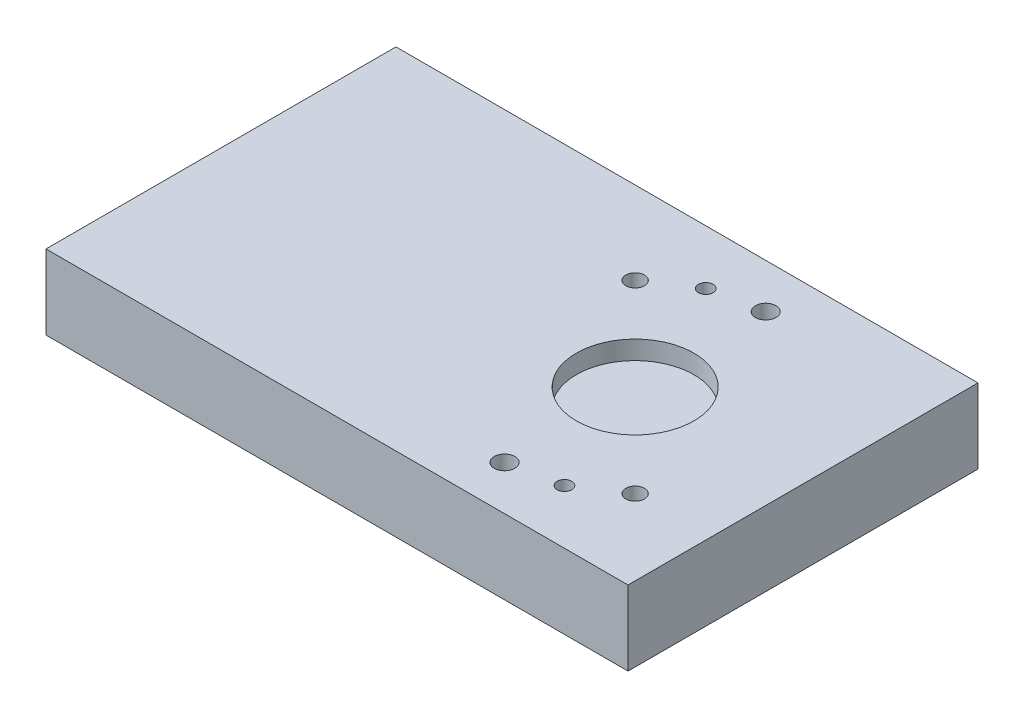
ISO-10303-21;
HEADER;
FILE_DESCRIPTION(('STEP AP214'),'2;1');
FILE_NAME('part.step','',(''),(''),'','','');
FILE_SCHEMA(('AUTOMOTIVE_DESIGN { 1 0 10303 214 1 1 1 1 }'));
ENDSEC;
DATA;
#1=APPLICATION_CONTEXT('core data for automotive mechanical design processes');
#2=APPLICATION_PROTOCOL_DEFINITION('international standard','automotive_design',2000,#1);
#3=PRODUCT_CONTEXT('',#1,'mechanical');
#4=PRODUCT('Part','Part','',(#3));
#5=PRODUCT_RELATED_PRODUCT_CATEGORY('part','',(#4));
#6=PRODUCT_DEFINITION_FORMATION('','',#4);
#7=PRODUCT_DEFINITION_CONTEXT('part definition',#1,'design');
#8=PRODUCT_DEFINITION('design','',#6,#7);
#9=PRODUCT_DEFINITION_SHAPE('','',#8);
#10=(LENGTH_UNIT() NAMED_UNIT(*) SI_UNIT(.MILLI.,.METRE.));
#11=(NAMED_UNIT(*) PLANE_ANGLE_UNIT() SI_UNIT($,.RADIAN.));
#12=(NAMED_UNIT(*) SI_UNIT($,.STERADIAN.) SOLID_ANGLE_UNIT());
#13=UNCERTAINTY_MEASURE_WITH_UNIT(LENGTH_MEASURE(1.E-05),#10,'distance_accuracy_value','');
#14=(GEOMETRIC_REPRESENTATION_CONTEXT(3) GLOBAL_UNCERTAINTY_ASSIGNED_CONTEXT((#13)) GLOBAL_UNIT_ASSIGNED_CONTEXT((#10,
#11,#12)) REPRESENTATION_CONTEXT('',''));
#15=CARTESIAN_POINT('',(0.,0.,0.));
#16=DIRECTION('',(0.,0.,1.));
#17=DIRECTION('',(1.,0.,0.));
#18=AXIS2_PLACEMENT_3D('',#15,#16,#17);
#19=CARTESIAN_POINT('',(57.15,25.4,59.563));
#20=DIRECTION('',(-1.,0.,0.));
#21=DIRECTION('',(0.,0.,1.));
#22=AXIS2_PLACEMENT_3D('',#19,#20,#21);
#23=PLANE('',#22);
#24=DIRECTION('',(0.,0.,-1.));
#25=VECTOR('',#24,1.);
#26=CARTESIAN_POINT('',(57.15,0.,59.563));
#27=LINE('',#26,#25);
#28=CARTESIAN_POINT('',(57.15,0.,59.563));
#29=VERTEX_POINT('',#28);
#30=CARTESIAN_POINT('',(57.15,0.,-59.563));
#31=VERTEX_POINT('',#30);
#32=EDGE_CURVE('E86',#29,#31,#27,.T.);
#33=ORIENTED_EDGE('',*,*,#32,.T.);
#34=DIRECTION('',(0.,-1.,0.));
#35=VECTOR('',#34,1.);
#36=CARTESIAN_POINT('',(57.15,25.4,-59.563));
#37=LINE('',#36,#35);
#38=CARTESIAN_POINT('',(57.15,25.4,-59.563));
#39=VERTEX_POINT('',#38);
#40=EDGE_CURVE('E11',#39,#31,#37,.T.);
#41=ORIENTED_EDGE('',*,*,#40,.F.);
#42=DIRECTION('',(0.,0.,-1.));
#43=VECTOR('',#42,1.);
#44=CARTESIAN_POINT('',(57.15,25.4,59.563));
#45=LINE('',#44,#43);
#46=CARTESIAN_POINT('',(57.15,25.4,59.563));
#47=VERTEX_POINT('',#46);
#48=EDGE_CURVE('E107',#47,#39,#45,.T.);
#49=ORIENTED_EDGE('',*,*,#48,.F.);
#50=DIRECTION('',(0.,-1.,0.));
#51=VECTOR('',#50,1.);
#52=CARTESIAN_POINT('',(57.15,25.4,59.563));
#53=LINE('',#52,#51);
#54=EDGE_CURVE('E46',#47,#29,#53,.T.);
#55=ORIENTED_EDGE('',*,*,#54,.T.);
#56=EDGE_LOOP('',(#33,#41,#49,#55));
#57=FACE_BOUND('',#56,.T.);
#58=ADVANCED_FACE('F38',(#57),#23,.F.);
#59=CARTESIAN_POINT('',(-57.15,25.4,-59.563));
#60=DIRECTION('',(0.,0.,1.));
#61=DIRECTION('',(1.,0.,0.));
#62=AXIS2_PLACEMENT_3D('',#59,#60,#61);
#63=PLANE('',#62);
#64=DIRECTION('',(-1.,0.,0.));
#65=VECTOR('',#64,1.);
#66=CARTESIAN_POINT('',(-57.15,0.,-59.563));
#67=LINE('',#66,#65);
#68=CARTESIAN_POINT('',(-140.97,0.,-59.563));
#69=VERTEX_POINT('',#68);
#70=EDGE_CURVE('E66',#31,#69,#67,.T.);
#71=ORIENTED_EDGE('',*,*,#70,.T.);
#72=DIRECTION('',(0.,-1.,0.));
#73=VECTOR('',#72,1.);
#74=CARTESIAN_POINT('',(-140.97,25.4,-59.563));
#75=LINE('',#74,#73);
#76=CARTESIAN_POINT('',(-140.97,25.4,-59.563));
#77=VERTEX_POINT('',#76);
#78=EDGE_CURVE('E82',#77,#69,#75,.T.);
#79=ORIENTED_EDGE('',*,*,#78,.F.);
#80=DIRECTION('',(-1.,0.,0.));
#81=VECTOR('',#80,1.);
#82=CARTESIAN_POINT('',(-57.15,25.4,-59.563));
#83=LINE('',#82,#81);
#84=EDGE_CURVE('E70',#39,#77,#83,.T.);
#85=ORIENTED_EDGE('',*,*,#84,.F.);
#86=ORIENTED_EDGE('',*,*,#40,.T.);
#87=EDGE_LOOP('',(#71,#79,#85,#86));
#88=FACE_BOUND('',#87,.T.);
#89=ADVANCED_FACE('F80',(#88),#63,.F.);
#90=CARTESIAN_POINT('',(-57.15,25.4,59.563));
#91=DIRECTION('',(0.,0.,-1.));
#92=DIRECTION('',(-1.,0.,0.));
#93=AXIS2_PLACEMENT_3D('',#90,#91,#92);
#94=PLANE('',#93);
#95=DIRECTION('',(1.,0.,0.));
#96=VECTOR('',#95,1.);
#97=CARTESIAN_POINT('',(-57.15,0.,59.563));
#98=LINE('',#97,#96);
#99=CARTESIAN_POINT('',(-140.97,0.,59.563));
#100=VERTEX_POINT('',#99);
#101=EDGE_CURVE('E85',#100,#29,#98,.T.);
#102=ORIENTED_EDGE('',*,*,#101,.T.);
#103=ORIENTED_EDGE('',*,*,#54,.F.);
#104=DIRECTION('',(1.,0.,0.));
#105=VECTOR('',#104,1.);
#106=CARTESIAN_POINT('',(-57.15,25.4,59.563));
#107=LINE('',#106,#105);
#108=CARTESIAN_POINT('',(-140.97,25.4,59.563));
#109=VERTEX_POINT('',#108);
#110=EDGE_CURVE('E54',#109,#47,#107,.T.);
#111=ORIENTED_EDGE('',*,*,#110,.F.);
#112=DIRECTION('',(0.,1.,0.));
#113=VECTOR('',#112,1.);
#114=CARTESIAN_POINT('',(-140.97,0.,59.563));
#115=LINE('',#114,#113);
#116=EDGE_CURVE('E94',#100,#109,#115,.T.);
#117=ORIENTED_EDGE('',*,*,#116,.F.);
#118=EDGE_LOOP('',(#102,#103,#111,#117));
#119=FACE_BOUND('',#118,.T.);
#120=ADVANCED_FACE('F116',(#119),#94,.F.);
#121=CARTESIAN_POINT('',(0.,25.4,0.));
#122=DIRECTION('',(0.,-1.,0.));
#123=DIRECTION('',(0.,0.,-1.));
#124=AXIS2_PLACEMENT_3D('',#121,#122,#123);
#125=PLANE('',#124);
#126=CARTESIAN_POINT('',(0.,25.4,0.));
#127=DIRECTION('',(0.,1.,0.));
#128=DIRECTION('',(0.,0.,1.));
#129=AXIS2_PLACEMENT_3D('',#126,#127,#128);
#130=CIRCLE('',#129,20.);
#131=CARTESIAN_POINT('',(0.,25.4,20.));
#132=VERTEX_POINT('',#131);
#133=EDGE_CURVE('E254',#132,#132,#130,.T.);
#134=ORIENTED_EDGE('',*,*,#133,.F.);
#135=EDGE_LOOP('',(#134));
#136=FACE_BOUND('',#135,.T.);
#137=CARTESIAN_POINT('',(-17.0102785686281,25.4,-41.066445220126));
#138=DIRECTION('',(0.,1.,0.));
#139=DIRECTION('',(0.,0.,1.));
#140=AXIS2_PLACEMENT_3D('',#137,#138,#139);
#141=CIRCLE('',#140,2.5);
#142=CARTESIAN_POINT('',(-17.0102785686281,25.4,-38.566445220126));
#143=VERTEX_POINT('',#142);
#144=EDGE_CURVE('E253',#143,#143,#141,.T.);
#145=ORIENTED_EDGE('',*,*,#144,.F.);
#146=EDGE_LOOP('',(#145));
#147=FACE_BOUND('',#146,.T.);
#148=CARTESIAN_POINT('',(17.0102785686319,25.4,41.066445220126));
#149=DIRECTION('',(0.,1.,0.));
#150=DIRECTION('',(0.,0.,1.));
#151=AXIS2_PLACEMENT_3D('',#148,#149,#150);
#152=CIRCLE('',#151,2.5);
#153=CARTESIAN_POINT('',(17.0102785686319,25.4,43.566445220126));
#154=VERTEX_POINT('',#153);
#155=EDGE_CURVE('E264',#154,#154,#152,.T.);
#156=ORIENTED_EDGE('',*,*,#155,.F.);
#157=EDGE_LOOP('',(#156));
#158=FACE_BOUND('',#157,.T.);
#159=CARTESIAN_POINT('',(0.,25.4,-44.45));
#160=DIRECTION('',(0.,1.,0.));
#161=DIRECTION('',(0.,0.,1.));
#162=AXIS2_PLACEMENT_3D('',#159,#160,#161);
#163=CIRCLE('',#162,3.5);
#164=CARTESIAN_POINT('',(0.,25.4,-40.95));
#165=VERTEX_POINT('',#164);
#166=EDGE_CURVE('E270',#165,#165,#163,.T.);
#167=ORIENTED_EDGE('',*,*,#166,.F.);
#168=EDGE_LOOP('',(#167));
#169=FACE_BOUND('',#168,.T.);
#170=CARTESIAN_POINT('',(3.77914784249995E-12,25.4,44.45));
#171=DIRECTION('',(0.,1.,0.));
#172=DIRECTION('',(0.,0.,1.));
#173=AXIS2_PLACEMENT_3D('',#170,#171,#172);
#174=CIRCLE('',#173,3.5);
#175=CARTESIAN_POINT('',(3.77914784249995E-12,25.4,47.95));
#176=VERTEX_POINT('',#175);
#177=EDGE_CURVE('E276',#176,#176,#174,.T.);
#178=ORIENTED_EDGE('',*,*,#177,.F.);
#179=EDGE_LOOP('',(#178));
#180=FACE_BOUND('',#179,.T.);
#181=CARTESIAN_POINT('',(-31.4308964237415,25.4,-31.4308964237407));
#182=DIRECTION('',(0.,1.,0.));
#183=DIRECTION('',(0.,0.,1.));
#184=AXIS2_PLACEMENT_3D('',#181,#182,#183);
#185=CIRCLE('',#184,3.17499999999999);
#186=CARTESIAN_POINT('',(-31.4308964237415,25.4,-28.2558964237407));
#187=VERTEX_POINT('',#186);
#188=EDGE_CURVE('E282',#187,#187,#185,.T.);
#189=ORIENTED_EDGE('',*,*,#188,.F.);
#190=EDGE_LOOP('',(#189));
#191=FACE_BOUND('',#190,.T.);
#192=CARTESIAN_POINT('',(31.4308964237453,25.4,31.4308964237407));
#193=DIRECTION('',(0.,1.,0.));
#194=DIRECTION('',(0.,0.,1.));
#195=AXIS2_PLACEMENT_3D('',#192,#193,#194);
#196=CIRCLE('',#195,3.17499999999999);
#197=CARTESIAN_POINT('',(31.4308964237453,25.4,34.6058964237407));
#198=VERTEX_POINT('',#197);
#199=EDGE_CURVE('E101',#198,#198,#196,.T.);
#200=ORIENTED_EDGE('',*,*,#199,.F.);
#201=EDGE_LOOP('',(#200));
#202=FACE_BOUND('',#201,.T.);
#203=ORIENTED_EDGE('',*,*,#48,.T.);
#204=ORIENTED_EDGE('',*,*,#84,.T.);
#205=DIRECTION('',(0.,0.,-1.));
#206=VECTOR('',#205,1.);
#207=CARTESIAN_POINT('',(-140.97,25.4,59.563));
#208=LINE('',#207,#206);
#209=EDGE_CURVE('E97',#109,#77,#208,.T.);
#210=ORIENTED_EDGE('',*,*,#209,.F.);
#211=ORIENTED_EDGE('',*,*,#110,.T.);
#212=EDGE_LOOP('',(#203,#204,#210,#211));
#213=FACE_BOUND('',#212,.T.);
#214=ADVANCED_FACE('F117',(#136,#147,#158,#169,#180,#191,#202,#213),#125,.F.);
#215=CARTESIAN_POINT('',(0.,0.,0.));
#216=DIRECTION('',(0.,-1.,0.));
#217=DIRECTION('',(0.,0.,-1.));
#218=AXIS2_PLACEMENT_3D('',#215,#216,#217);
#219=PLANE('',#218);
#220=CARTESIAN_POINT('',(-17.0102785686281,0.,-41.066445220126));
#221=DIRECTION('',(0.,1.,0.));
#222=DIRECTION('',(0.,0.,1.));
#223=AXIS2_PLACEMENT_3D('',#220,#221,#222);
#224=CIRCLE('',#223,2.5);
#225=CARTESIAN_POINT('',(-17.0102785686281,0.,-38.566445220126));
#226=VERTEX_POINT('',#225);
#227=EDGE_CURVE('E257',#226,#226,#224,.T.);
#228=ORIENTED_EDGE('',*,*,#227,.T.);
#229=EDGE_LOOP('',(#228));
#230=FACE_BOUND('',#229,.T.);
#231=CARTESIAN_POINT('',(17.0102785686319,0.,41.066445220126));
#232=DIRECTION('',(0.,1.,0.));
#233=DIRECTION('',(0.,0.,1.));
#234=AXIS2_PLACEMENT_3D('',#231,#232,#233);
#235=CIRCLE('',#234,2.5);
#236=CARTESIAN_POINT('',(17.0102785686319,0.,43.566445220126));
#237=VERTEX_POINT('',#236);
#238=EDGE_CURVE('E267',#237,#237,#235,.T.);
#239=ORIENTED_EDGE('',*,*,#238,.T.);
#240=EDGE_LOOP('',(#239));
#241=FACE_BOUND('',#240,.T.);
#242=CARTESIAN_POINT('',(0.,0.,-44.45));
#243=DIRECTION('',(0.,1.,0.));
#244=DIRECTION('',(0.,0.,1.));
#245=AXIS2_PLACEMENT_3D('',#242,#243,#244);
#246=CIRCLE('',#245,3.5);
#247=CARTESIAN_POINT('',(0.,0.,-40.95));
#248=VERTEX_POINT('',#247);
#249=EDGE_CURVE('E273',#248,#248,#246,.T.);
#250=ORIENTED_EDGE('',*,*,#249,.T.);
#251=EDGE_LOOP('',(#250));
#252=FACE_BOUND('',#251,.T.);
#253=CARTESIAN_POINT('',(3.77914784249995E-12,0.,44.45));
#254=DIRECTION('',(0.,1.,0.));
#255=DIRECTION('',(0.,0.,1.));
#256=AXIS2_PLACEMENT_3D('',#253,#254,#255);
#257=CIRCLE('',#256,3.5);
#258=CARTESIAN_POINT('',(3.77914784249995E-12,0.,47.95));
#259=VERTEX_POINT('',#258);
#260=EDGE_CURVE('E279',#259,#259,#257,.T.);
#261=ORIENTED_EDGE('',*,*,#260,.T.);
#262=EDGE_LOOP('',(#261));
#263=FACE_BOUND('',#262,.T.);
#264=CARTESIAN_POINT('',(-31.4308964237415,0.,-31.4308964237407));
#265=DIRECTION('',(0.,1.,0.));
#266=DIRECTION('',(0.,0.,1.));
#267=AXIS2_PLACEMENT_3D('',#264,#265,#266);
#268=CIRCLE('',#267,3.17499999999999);
#269=CARTESIAN_POINT('',(-31.4308964237415,0.,-28.2558964237407));
#270=VERTEX_POINT('',#269);
#271=EDGE_CURVE('E285',#270,#270,#268,.T.);
#272=ORIENTED_EDGE('',*,*,#271,.T.);
#273=EDGE_LOOP('',(#272));
#274=FACE_BOUND('',#273,.T.);
#275=CARTESIAN_POINT('',(31.4308964237453,0.,31.4308964237407));
#276=DIRECTION('',(0.,1.,0.));
#277=DIRECTION('',(0.,0.,1.));
#278=AXIS2_PLACEMENT_3D('',#275,#276,#277);
#279=CIRCLE('',#278,3.175);
#280=CARTESIAN_POINT('',(31.4308964237453,0.,34.6058964237407));
#281=VERTEX_POINT('',#280);
#282=EDGE_CURVE('E98',#281,#281,#279,.T.);
#283=ORIENTED_EDGE('',*,*,#282,.T.);
#284=EDGE_LOOP('',(#283));
#285=FACE_BOUND('',#284,.T.);
#286=ORIENTED_EDGE('',*,*,#32,.F.);
#287=ORIENTED_EDGE('',*,*,#101,.F.);
#288=DIRECTION('',(0.,0.,1.));
#289=VECTOR('',#288,1.);
#290=CARTESIAN_POINT('',(-140.97,0.,-59.563));
#291=LINE('',#290,#289);
#292=EDGE_CURVE('E89',#69,#100,#291,.T.);
#293=ORIENTED_EDGE('',*,*,#292,.F.);
#294=ORIENTED_EDGE('',*,*,#70,.F.);
#295=EDGE_LOOP('',(#286,#287,#293,#294));
#296=FACE_BOUND('',#295,.T.);
#297=ADVANCED_FACE('F90',(#230,#241,#252,#263,#274,#285,#296),#219,.T.);
#298=CARTESIAN_POINT('',(-140.97,0.,0.));
#299=DIRECTION('',(-1.,0.,0.));
#300=DIRECTION('',(0.,0.,1.));
#301=AXIS2_PLACEMENT_3D('',#298,#299,#300);
#302=PLANE('',#301);
#303=ORIENTED_EDGE('',*,*,#78,.T.);
#304=ORIENTED_EDGE('',*,*,#292,.T.);
#305=ORIENTED_EDGE('',*,*,#116,.T.);
#306=ORIENTED_EDGE('',*,*,#209,.T.);
#307=EDGE_LOOP('',(#303,#304,#305,#306));
#308=FACE_BOUND('',#307,.T.);
#309=ADVANCED_FACE('F96',(#308),#302,.T.);
#310=CARTESIAN_POINT('',(31.4308964237453,25.4,31.4308964237407));
#311=DIRECTION('',(0.,1.,0.));
#312=DIRECTION('',(0.,0.,1.));
#313=AXIS2_PLACEMENT_3D('',#310,#311,#312);
#314=CYLINDRICAL_SURFACE('',#313,3.17499999999999);
#315=ORIENTED_EDGE('',*,*,#282,.F.);
#316=EDGE_LOOP('',(#315));
#317=FACE_BOUND('',#316,.T.);
#318=ORIENTED_EDGE('',*,*,#199,.T.);
#319=EDGE_LOOP('',(#318));
#320=FACE_BOUND('',#319,.T.);
#321=ADVANCED_FACE('F152',(#317,#320),#314,.F.);
#322=CARTESIAN_POINT('',(-31.4308964237415,25.4,-31.4308964237407));
#323=DIRECTION('',(0.,1.,0.));
#324=DIRECTION('',(0.,0.,1.));
#325=AXIS2_PLACEMENT_3D('',#322,#323,#324);
#326=CYLINDRICAL_SURFACE('',#325,3.17499999999999);
#327=ORIENTED_EDGE('',*,*,#271,.F.);
#328=EDGE_LOOP('',(#327));
#329=FACE_BOUND('',#328,.T.);
#330=ORIENTED_EDGE('',*,*,#188,.T.);
#331=EDGE_LOOP('',(#330));
#332=FACE_BOUND('',#331,.T.);
#333=ADVANCED_FACE('F161',(#329,#332),#326,.F.);
#334=CARTESIAN_POINT('',(3.77914784249995E-12,25.4,44.45));
#335=DIRECTION('',(0.,1.,0.));
#336=DIRECTION('',(0.,0.,1.));
#337=AXIS2_PLACEMENT_3D('',#334,#335,#336);
#338=CYLINDRICAL_SURFACE('',#337,3.5);
#339=ORIENTED_EDGE('',*,*,#260,.F.);
#340=EDGE_LOOP('',(#339));
#341=FACE_BOUND('',#340,.T.);
#342=ORIENTED_EDGE('',*,*,#177,.T.);
#343=EDGE_LOOP('',(#342));
#344=FACE_BOUND('',#343,.T.);
#345=ADVANCED_FACE('F171',(#341,#344),#338,.F.);
#346=CARTESIAN_POINT('',(0.,25.4,-44.45));
#347=DIRECTION('',(0.,1.,0.));
#348=DIRECTION('',(0.,0.,1.));
#349=AXIS2_PLACEMENT_3D('',#346,#347,#348);
#350=CYLINDRICAL_SURFACE('',#349,3.5);
#351=ORIENTED_EDGE('',*,*,#249,.F.);
#352=EDGE_LOOP('',(#351));
#353=FACE_BOUND('',#352,.T.);
#354=ORIENTED_EDGE('',*,*,#166,.T.);
#355=EDGE_LOOP('',(#354));
#356=FACE_BOUND('',#355,.T.);
#357=ADVANCED_FACE('F182',(#353,#356),#350,.F.);
#358=CARTESIAN_POINT('',(17.0102785686319,25.4,41.066445220126));
#359=DIRECTION('',(0.,1.,0.));
#360=DIRECTION('',(0.,0.,1.));
#361=AXIS2_PLACEMENT_3D('',#358,#359,#360);
#362=CYLINDRICAL_SURFACE('',#361,2.5);
#363=ORIENTED_EDGE('',*,*,#238,.F.);
#364=EDGE_LOOP('',(#363));
#365=FACE_BOUND('',#364,.T.);
#366=ORIENTED_EDGE('',*,*,#155,.T.);
#367=EDGE_LOOP('',(#366));
#368=FACE_BOUND('',#367,.T.);
#369=ADVANCED_FACE('F194',(#365,#368),#362,.F.);
#370=CARTESIAN_POINT('',(-17.0102785686281,25.4,-41.066445220126));
#371=DIRECTION('',(0.,1.,0.));
#372=DIRECTION('',(0.,0.,1.));
#373=AXIS2_PLACEMENT_3D('',#370,#371,#372);
#374=CYLINDRICAL_SURFACE('',#373,2.5);
#375=ORIENTED_EDGE('',*,*,#227,.F.);
#376=EDGE_LOOP('',(#375));
#377=FACE_BOUND('',#376,.T.);
#378=ORIENTED_EDGE('',*,*,#144,.T.);
#379=EDGE_LOOP('',(#378));
#380=FACE_BOUND('',#379,.T.);
#381=ADVANCED_FACE('F211',(#377,#380),#374,.F.);
#382=CARTESIAN_POINT('',(0.,19.05,0.));
#383=DIRECTION('',(0.,1.,0.));
#384=DIRECTION('',(0.,0.,1.));
#385=AXIS2_PLACEMENT_3D('',#382,#383,#384);
#386=CYLINDRICAL_SURFACE('',#385,20.);
#387=CARTESIAN_POINT('',(0.,19.05,0.));
#388=DIRECTION('',(0.,1.,0.));
#389=DIRECTION('',(0.,0.,1.));
#390=AXIS2_PLACEMENT_3D('',#387,#388,#389);
#391=CIRCLE('',#390,20.);
#392=CARTESIAN_POINT('',(0.,19.05,20.));
#393=VERTEX_POINT('',#392);
#394=EDGE_CURVE('E252',#393,#393,#391,.T.);
#395=ORIENTED_EDGE('',*,*,#394,.F.);
#396=EDGE_LOOP('',(#395));
#397=FACE_BOUND('',#396,.T.);
#398=ORIENTED_EDGE('',*,*,#133,.T.);
#399=EDGE_LOOP('',(#398));
#400=FACE_BOUND('',#399,.T.);
#401=ADVANCED_FACE('F221',(#397,#400),#386,.F.);
#402=CARTESIAN_POINT('',(0.,19.05,0.));
#403=DIRECTION('',(0.,1.,0.));
#404=DIRECTION('',(0.,0.,1.));
#405=AXIS2_PLACEMENT_3D('',#402,#403,#404);
#406=PLANE('',#405);
#407=ORIENTED_EDGE('',*,*,#394,.T.);
#408=EDGE_LOOP('',(#407));
#409=FACE_BOUND('',#408,.T.);
#410=ADVANCED_FACE('F236',(#409),#406,.T.);
#411=CLOSED_SHELL('',(#58,#89,#120,#214,#297,#309,#321,#333,#345,#357,#369,#381,#401,#410));
#412=MANIFOLD_SOLID_BREP('B2',#411);
#413=ADVANCED_BREP_SHAPE_REPRESENTATION('',(#18,#412),#14);
#414=SHAPE_DEFINITION_REPRESENTATION(#9,#413);
ENDSEC;
END-ISO-10303-21;
